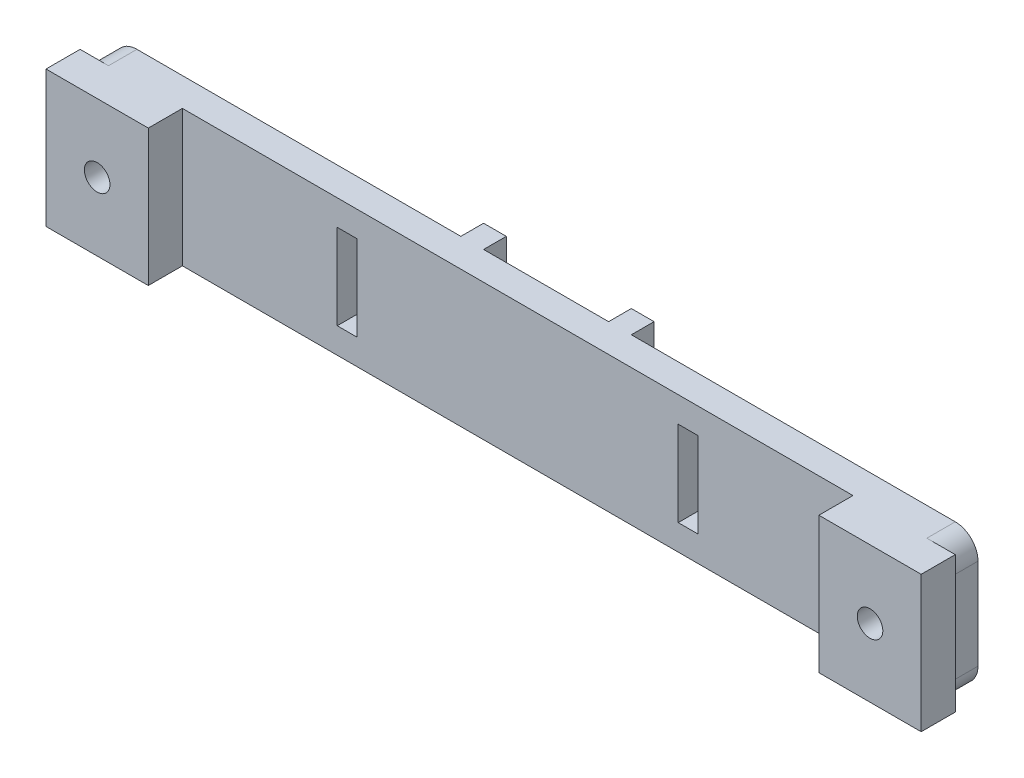
ISO-10303-21;
HEADER;
FILE_DESCRIPTION(('STEP AP214'),'2;1');
FILE_NAME('part.step','',(''),(''),'','','');
FILE_SCHEMA(('AUTOMOTIVE_DESIGN { 1 0 10303 214 1 1 1 1 }'));
ENDSEC;
DATA;
#1=APPLICATION_CONTEXT('core data for automotive mechanical design processes');
#2=APPLICATION_PROTOCOL_DEFINITION('international standard','automotive_design',2000,#1);
#3=PRODUCT_CONTEXT('',#1,'mechanical');
#4=PRODUCT('Part','Part','',(#3));
#5=PRODUCT_RELATED_PRODUCT_CATEGORY('part','',(#4));
#6=PRODUCT_DEFINITION_FORMATION('','',#4);
#7=PRODUCT_DEFINITION_CONTEXT('part definition',#1,'design');
#8=PRODUCT_DEFINITION('design','',#6,#7);
#9=PRODUCT_DEFINITION_SHAPE('','',#8);
#10=(LENGTH_UNIT() NAMED_UNIT(*) SI_UNIT(.MILLI.,.METRE.));
#11=(NAMED_UNIT(*) PLANE_ANGLE_UNIT() SI_UNIT($,.RADIAN.));
#12=(NAMED_UNIT(*) SI_UNIT($,.STERADIAN.) SOLID_ANGLE_UNIT());
#13=UNCERTAINTY_MEASURE_WITH_UNIT(LENGTH_MEASURE(1.E-05),#10,'distance_accuracy_value','');
#14=(GEOMETRIC_REPRESENTATION_CONTEXT(3) GLOBAL_UNCERTAINTY_ASSIGNED_CONTEXT((#13)) GLOBAL_UNIT_ASSIGNED_CONTEXT((#10,
#11,#12)) REPRESENTATION_CONTEXT('',''));
#15=CARTESIAN_POINT('',(0.,0.,0.));
#16=DIRECTION('',(0.,0.,1.));
#17=DIRECTION('',(1.,0.,0.));
#18=AXIS2_PLACEMENT_3D('',#15,#16,#17);
#19=CARTESIAN_POINT('',(-72.,-8.,0.));
#20=DIRECTION('',(0.,0.,1.));
#21=DIRECTION('',(1.,0.,0.));
#22=AXIS2_PLACEMENT_3D('',#19,#20,#21);
#23=PLANE('',#22);
#24=DIRECTION('',(1.,0.,0.));
#25=VECTOR('',#24,1.);
#26=CARTESIAN_POINT('',(28.25,-7.5,0.));
#27=LINE('',#26,#25);
#28=CARTESIAN_POINT('',(28.25,-7.5,0.));
#29=VERTEX_POINT('',#28);
#30=CARTESIAN_POINT('',(31.75,-7.5,0.));
#31=VERTEX_POINT('',#30);
#32=EDGE_CURVE('E478',#29,#31,#27,.T.);
#33=ORIENTED_EDGE('',*,*,#32,.T.);
#34=DIRECTION('',(0.,1.,0.));
#35=VECTOR('',#34,1.);
#36=CARTESIAN_POINT('',(31.75,-7.5,0.));
#37=LINE('',#36,#35);
#38=CARTESIAN_POINT('',(31.75,7.5,0.));
#39=VERTEX_POINT('',#38);
#40=EDGE_CURVE('E488',#31,#39,#37,.T.);
#41=ORIENTED_EDGE('',*,*,#40,.T.);
#42=DIRECTION('',(-1.,0.,0.));
#43=VECTOR('',#42,1.);
#44=CARTESIAN_POINT('',(28.25,7.5,0.));
#45=LINE('',#44,#43);
#46=CARTESIAN_POINT('',(28.25,7.5,0.));
#47=VERTEX_POINT('',#46);
#48=EDGE_CURVE('E500',#39,#47,#45,.T.);
#49=ORIENTED_EDGE('',*,*,#48,.T.);
#50=DIRECTION('',(0.,-1.,0.));
#51=VECTOR('',#50,1.);
#52=CARTESIAN_POINT('',(28.25,-7.5,0.));
#53=LINE('',#52,#51);
#54=EDGE_CURVE('E497',#47,#29,#53,.T.);
#55=ORIENTED_EDGE('',*,*,#54,.T.);
#56=EDGE_LOOP('',(#33,#41,#49,#55));
#57=FACE_BOUND('',#56,.T.);
#58=CARTESIAN_POINT('',(68.,0.,0.));
#59=DIRECTION('',(0.,0.,1.));
#60=DIRECTION('',(1.,0.,0.));
#61=AXIS2_PLACEMENT_3D('',#58,#59,#60);
#62=CIRCLE('',#61,2.25);
#63=CARTESIAN_POINT('',(70.25,0.,0.));
#64=VERTEX_POINT('',#63);
#65=EDGE_CURVE('E468',#64,#64,#62,.T.);
#66=ORIENTED_EDGE('',*,*,#65,.T.);
#67=EDGE_LOOP('',(#66));
#68=FACE_BOUND('',#67,.T.);
#69=DIRECTION('',(1.,0.,0.));
#70=VECTOR('',#69,1.);
#71=CARTESIAN_POINT('',(-72.,-12.,0.));
#72=LINE('',#71,#70);
#73=CARTESIAN_POINT('',(15.,-12.,0.));
#74=VERTEX_POINT('',#73);
#75=CARTESIAN_POINT('',(72.,-12.,0.));
#76=VERTEX_POINT('',#75);
#77=EDGE_CURVE('E251',#74,#76,#72,.T.);
#78=ORIENTED_EDGE('',*,*,#77,.F.);
#79=DIRECTION('',(0.,1.,0.));
#80=VECTOR('',#79,1.);
#81=CARTESIAN_POINT('',(15.,-12.,0.));
#82=LINE('',#81,#80);
#83=CARTESIAN_POINT('',(15.,12.,0.));
#84=VERTEX_POINT('',#83);
#85=EDGE_CURVE('E261',#74,#84,#82,.T.);
#86=ORIENTED_EDGE('',*,*,#85,.T.);
#87=DIRECTION('',(-1.,0.,0.));
#88=VECTOR('',#87,1.);
#89=CARTESIAN_POINT('',(72.,12.,0.));
#90=LINE('',#89,#88);
#91=CARTESIAN_POINT('',(72.,12.,0.));
#92=VERTEX_POINT('',#91);
#93=EDGE_CURVE('E289',#92,#84,#90,.T.);
#94=ORIENTED_EDGE('',*,*,#93,.F.);
#95=CARTESIAN_POINT('',(72.,8.,0.));
#96=DIRECTION('',(0.,0.,1.));
#97=DIRECTION('',(1.,0.,0.));
#98=AXIS2_PLACEMENT_3D('',#95,#96,#97);
#99=CIRCLE('',#98,3.99999999999999);
#100=CARTESIAN_POINT('',(76.,8.,0.));
#101=VERTEX_POINT('',#100);
#102=EDGE_CURVE('E284',#101,#92,#99,.T.);
#103=ORIENTED_EDGE('',*,*,#102,.F.);
#104=DIRECTION('',(0.,1.,0.));
#105=VECTOR('',#104,1.);
#106=CARTESIAN_POINT('',(76.,-8.,0.));
#107=LINE('',#106,#105);
#108=CARTESIAN_POINT('',(76.,-8.,0.));
#109=VERTEX_POINT('',#108);
#110=EDGE_CURVE('E281',#109,#101,#107,.T.);
#111=ORIENTED_EDGE('',*,*,#110,.F.);
#112=CARTESIAN_POINT('',(72.,-8.,0.));
#113=DIRECTION('',(0.,0.,1.));
#114=DIRECTION('',(1.,0.,0.));
#115=AXIS2_PLACEMENT_3D('',#112,#113,#114);
#116=CIRCLE('',#115,3.99999999999999);
#117=EDGE_CURVE('E271',#76,#109,#116,.T.);
#118=ORIENTED_EDGE('',*,*,#117,.F.);
#119=EDGE_LOOP('',(#78,#86,#94,#103,#111,#118));
#120=FACE_BOUND('',#119,.T.);
#121=ADVANCED_FACE('F36',(#57,#68,#120),#23,.F.);
#122=CARTESIAN_POINT('',(11.,12.,0.));
#123=VERTEX_POINT('',#122);
#124=CARTESIAN_POINT('',(-11.,12.,0.));
#125=VERTEX_POINT('',#124);
#126=EDGE_CURVE('E292',#123,#125,#90,.T.);
#127=ORIENTED_EDGE('',*,*,#126,.F.);
#128=DIRECTION('',(0.,-1.,0.));
#129=VECTOR('',#128,1.);
#130=CARTESIAN_POINT('',(11.,-12.,0.));
#131=LINE('',#130,#129);
#132=CARTESIAN_POINT('',(11.,-12.,0.));
#133=VERTEX_POINT('',#132);
#134=EDGE_CURVE('E51',#123,#133,#131,.T.);
#135=ORIENTED_EDGE('',*,*,#134,.T.);
#136=CARTESIAN_POINT('',(-11.,-12.,0.));
#137=VERTEX_POINT('',#136);
#138=EDGE_CURVE('E272',#137,#133,#72,.T.);
#139=ORIENTED_EDGE('',*,*,#138,.F.);
#140=DIRECTION('',(0.,1.,0.));
#141=VECTOR('',#140,1.);
#142=CARTESIAN_POINT('',(-11.,-12.,0.));
#143=LINE('',#142,#141);
#144=EDGE_CURVE('E267',#137,#125,#143,.T.);
#145=ORIENTED_EDGE('',*,*,#144,.T.);
#146=EDGE_LOOP('',(#127,#135,#139,#145));
#147=FACE_BOUND('',#146,.T.);
#148=ADVANCED_FACE('F558',(#147),#23,.F.);
#149=CARTESIAN_POINT('',(-72.,-8.,5.));
#150=DIRECTION('',(0.,0.,1.));
#151=DIRECTION('',(1.,0.,0.));
#152=AXIS2_PLACEMENT_3D('',#149,#150,#151);
#153=PLANE('',#152);
#154=DIRECTION('',(0.,1.,0.));
#155=VECTOR('',#154,1.);
#156=CARTESIAN_POINT('',(-28.25,-7.5,5.));
#157=LINE('',#156,#155);
#158=CARTESIAN_POINT('',(-28.25,-7.5,5.));
#159=VERTEX_POINT('',#158);
#160=CARTESIAN_POINT('',(-28.25,7.5,5.));
#161=VERTEX_POINT('',#160);
#162=EDGE_CURVE('E455',#159,#161,#157,.T.);
#163=ORIENTED_EDGE('',*,*,#162,.F.);
#164=DIRECTION('',(1.,0.,0.));
#165=VECTOR('',#164,1.);
#166=CARTESIAN_POINT('',(-31.75,-7.5,5.));
#167=LINE('',#166,#165);
#168=CARTESIAN_POINT('',(-31.75,-7.5,5.));
#169=VERTEX_POINT('',#168);
#170=EDGE_CURVE('E445',#169,#159,#167,.T.);
#171=ORIENTED_EDGE('',*,*,#170,.F.);
#172=DIRECTION('',(0.,-1.,0.));
#173=VECTOR('',#172,1.);
#174=CARTESIAN_POINT('',(-31.75,-7.5,5.));
#175=LINE('',#174,#173);
#176=CARTESIAN_POINT('',(-31.75,7.5,5.));
#177=VERTEX_POINT('',#176);
#178=EDGE_CURVE('E461',#177,#169,#175,.T.);
#179=ORIENTED_EDGE('',*,*,#178,.F.);
#180=DIRECTION('',(-1.,0.,0.));
#181=VECTOR('',#180,1.);
#182=CARTESIAN_POINT('',(-31.75,7.5,5.));
#183=LINE('',#182,#181);
#184=EDGE_CURVE('E457',#161,#177,#183,.T.);
#185=ORIENTED_EDGE('',*,*,#184,.F.);
#186=EDGE_LOOP('',(#163,#171,#179,#185));
#187=FACE_BOUND('',#186,.T.);
#188=DIRECTION('',(0.,1.,0.));
#189=VECTOR('',#188,1.);
#190=CARTESIAN_POINT('',(31.75,-7.5,5.));
#191=LINE('',#190,#189);
#192=CARTESIAN_POINT('',(31.75,-7.5,5.));
#193=VERTEX_POINT('',#192);
#194=CARTESIAN_POINT('',(31.75,7.5,5.));
#195=VERTEX_POINT('',#194);
#196=EDGE_CURVE('E458',#193,#195,#191,.T.);
#197=ORIENTED_EDGE('',*,*,#196,.F.);
#198=DIRECTION('',(1.,0.,0.));
#199=VECTOR('',#198,1.);
#200=CARTESIAN_POINT('',(28.25,-7.5,5.));
#201=LINE('',#200,#199);
#202=CARTESIAN_POINT('',(28.25,-7.5,5.));
#203=VERTEX_POINT('',#202);
#204=EDGE_CURVE('E484',#203,#193,#201,.T.);
#205=ORIENTED_EDGE('',*,*,#204,.F.);
#206=DIRECTION('',(0.,-1.,0.));
#207=VECTOR('',#206,1.);
#208=CARTESIAN_POINT('',(28.25,-7.5,5.));
#209=LINE('',#208,#207);
#210=CARTESIAN_POINT('',(28.25,7.5,5.));
#211=VERTEX_POINT('',#210);
#212=EDGE_CURVE('E487',#211,#203,#209,.T.);
#213=ORIENTED_EDGE('',*,*,#212,.F.);
#214=DIRECTION('',(-1.,0.,0.));
#215=VECTOR('',#214,1.);
#216=CARTESIAN_POINT('',(28.25,7.5,5.));
#217=LINE('',#216,#215);
#218=EDGE_CURVE('E491',#195,#211,#217,.T.);
#219=ORIENTED_EDGE('',*,*,#218,.F.);
#220=EDGE_LOOP('',(#197,#205,#213,#219));
#221=FACE_BOUND('',#220,.T.);
#222=DIRECTION('',(1.,0.,0.));
#223=VECTOR('',#222,1.);
#224=CARTESIAN_POINT('',(-72.,-12.,5.));
#225=LINE('',#224,#223);
#226=CARTESIAN_POINT('',(-59.,-12.,5.));
#227=VERTEX_POINT('',#226);
#228=CARTESIAN_POINT('',(59.,-12.,5.));
#229=VERTEX_POINT('',#228);
#230=EDGE_CURVE('E380',#227,#229,#225,.T.);
#231=ORIENTED_EDGE('',*,*,#230,.T.);
#232=DIRECTION('',(0.,-1.,0.));
#233=VECTOR('',#232,1.);
#234=CARTESIAN_POINT('',(59.,-12.,5.));
#235=LINE('',#234,#233);
#236=CARTESIAN_POINT('',(59.,12.,5.));
#237=VERTEX_POINT('',#236);
#238=EDGE_CURVE('E327',#237,#229,#235,.T.);
#239=ORIENTED_EDGE('',*,*,#238,.F.);
#240=DIRECTION('',(-1.,0.,0.));
#241=VECTOR('',#240,1.);
#242=CARTESIAN_POINT('',(72.,12.,5.));
#243=LINE('',#242,#241);
#244=CARTESIAN_POINT('',(-59.,12.,5.));
#245=VERTEX_POINT('',#244);
#246=EDGE_CURVE('E388',#237,#245,#243,.T.);
#247=ORIENTED_EDGE('',*,*,#246,.T.);
#248=DIRECTION('',(0.,1.,0.));
#249=VECTOR('',#248,1.);
#250=CARTESIAN_POINT('',(-59.,-12.,5.));
#251=LINE('',#250,#249);
#252=EDGE_CURVE('E343',#227,#245,#251,.T.);
#253=ORIENTED_EDGE('',*,*,#252,.F.);
#254=EDGE_LOOP('',(#231,#239,#247,#253));
#255=FACE_BOUND('',#254,.T.);
#256=ADVANCED_FACE('F538',(#187,#221,#255),#153,.T.);
#257=CARTESIAN_POINT('',(-72.,-8.,5.));
#258=DIRECTION('',(0.,0.,-1.));
#259=DIRECTION('',(-1.,0.,0.));
#260=AXIS2_PLACEMENT_3D('',#257,#258,#259);
#261=CYLINDRICAL_SURFACE('',#260,3.99999999999999);
#262=CARTESIAN_POINT('',(-72.,-8.,0.));
#263=DIRECTION('',(0.,0.,1.));
#264=DIRECTION('',(1.,0.,0.));
#265=AXIS2_PLACEMENT_3D('',#262,#263,#264);
#266=CIRCLE('',#265,3.99999999999999);
#267=CARTESIAN_POINT('',(-76.,-8.,0.));
#268=VERTEX_POINT('',#267);
#269=CARTESIAN_POINT('',(-72.,-12.,0.));
#270=VERTEX_POINT('',#269);
#271=EDGE_CURVE('E273',#268,#270,#266,.T.);
#272=ORIENTED_EDGE('',*,*,#271,.T.);
#273=DIRECTION('',(0.,0.,-1.));
#274=VECTOR('',#273,1.);
#275=CARTESIAN_POINT('',(-72.,-12.,5.));
#276=LINE('',#275,#274);
#277=CARTESIAN_POINT('',(-72.,-12.,5.));
#278=VERTEX_POINT('',#277);
#279=EDGE_CURVE('E11',#278,#270,#276,.T.);
#280=ORIENTED_EDGE('',*,*,#279,.F.);
#281=CARTESIAN_POINT('',(-72.,-8.,5.));
#282=DIRECTION('',(0.,0.,1.));
#283=DIRECTION('',(1.,0.,0.));
#284=AXIS2_PLACEMENT_3D('',#281,#282,#283);
#285=CIRCLE('',#284,3.99999999999999);
#286=CARTESIAN_POINT('',(-76.,-8.,5.));
#287=VERTEX_POINT('',#286);
#288=EDGE_CURVE('E296',#287,#278,#285,.T.);
#289=ORIENTED_EDGE('',*,*,#288,.F.);
#290=DIRECTION('',(0.,0.,-1.));
#291=VECTOR('',#290,1.);
#292=CARTESIAN_POINT('',(-76.,-8.,5.));
#293=LINE('',#292,#291);
#294=EDGE_CURVE('E297',#287,#268,#293,.T.);
#295=ORIENTED_EDGE('',*,*,#294,.T.);
#296=EDGE_LOOP('',(#272,#280,#289,#295));
#297=FACE_BOUND('',#296,.T.);
#298=ADVANCED_FACE('F38',(#297),#261,.T.);
#299=CARTESIAN_POINT('',(-72.,-12.,5.));
#300=DIRECTION('',(0.,1.,0.));
#301=DIRECTION('',(0.,0.,1.));
#302=AXIS2_PLACEMENT_3D('',#299,#300,#301);
#303=PLANE('',#302);
#304=CARTESIAN_POINT('',(-15.,-12.,0.));
#305=VERTEX_POINT('',#304);
#306=EDGE_CURVE('E275',#270,#305,#72,.T.);
#307=ORIENTED_EDGE('',*,*,#306,.T.);
#308=DIRECTION('',(0.,0.,1.));
#309=VECTOR('',#308,1.);
#310=CARTESIAN_POINT('',(-15.,-12.,-4.));
#311=LINE('',#310,#309);
#312=CARTESIAN_POINT('',(-15.,-12.,-4.));
#313=VERTEX_POINT('',#312);
#314=EDGE_CURVE('E59',#313,#305,#311,.T.);
#315=ORIENTED_EDGE('',*,*,#314,.F.);
#316=DIRECTION('',(1.,0.,0.));
#317=VECTOR('',#316,1.);
#318=CARTESIAN_POINT('',(-15.,-12.,-4.));
#319=LINE('',#318,#317);
#320=CARTESIAN_POINT('',(-11.,-12.,-4.));
#321=VERTEX_POINT('',#320);
#322=EDGE_CURVE('E440',#313,#321,#319,.T.);
#323=ORIENTED_EDGE('',*,*,#322,.T.);
#324=DIRECTION('',(0.,0.,1.));
#325=VECTOR('',#324,1.);
#326=CARTESIAN_POINT('',(-11.,-12.,-4.));
#327=LINE('',#326,#325);
#328=EDGE_CURVE('E431',#321,#137,#327,.T.);
#329=ORIENTED_EDGE('',*,*,#328,.T.);
#330=ORIENTED_EDGE('',*,*,#138,.T.);
#331=DIRECTION('',(0.,0.,1.));
#332=VECTOR('',#331,1.);
#333=CARTESIAN_POINT('',(11.,-12.,-4.));
#334=LINE('',#333,#332);
#335=CARTESIAN_POINT('',(11.,-12.,-4.));
#336=VERTEX_POINT('',#335);
#337=EDGE_CURVE('E258',#336,#133,#334,.T.);
#338=ORIENTED_EDGE('',*,*,#337,.F.);
#339=DIRECTION('',(1.,0.,0.));
#340=VECTOR('',#339,1.);
#341=CARTESIAN_POINT('',(11.,-12.,-4.));
#342=LINE('',#341,#340);
#343=CARTESIAN_POINT('',(15.,-12.,-4.));
#344=VERTEX_POINT('',#343);
#345=EDGE_CURVE('E254',#336,#344,#342,.T.);
#346=ORIENTED_EDGE('',*,*,#345,.T.);
#347=DIRECTION('',(0.,0.,1.));
#348=VECTOR('',#347,1.);
#349=CARTESIAN_POINT('',(15.,-12.,-4.));
#350=LINE('',#349,#348);
#351=EDGE_CURVE('E245',#344,#74,#350,.T.);
#352=ORIENTED_EDGE('',*,*,#351,.T.);
#353=ORIENTED_EDGE('',*,*,#77,.T.);
#354=DIRECTION('',(0.,0.,-1.));
#355=VECTOR('',#354,1.);
#356=CARTESIAN_POINT('',(72.,-12.,5.));
#357=LINE('',#356,#355);
#358=CARTESIAN_POINT('',(72.,-12.,5.));
#359=VERTEX_POINT('',#358);
#360=EDGE_CURVE('E44',#359,#76,#357,.T.);
#361=ORIENTED_EDGE('',*,*,#360,.F.);
#362=DIRECTION('',(1.,0.,0.));
#363=VECTOR('',#362,1.);
#364=CARTESIAN_POINT('',(59.,-12.,5.));
#365=LINE('',#364,#363);
#366=CARTESIAN_POINT('',(77.,-12.,5.));
#367=VERTEX_POINT('',#366);
#368=EDGE_CURVE('E319',#359,#367,#365,.T.);
#369=ORIENTED_EDGE('',*,*,#368,.T.);
#370=DIRECTION('',(0.,0.,-1.));
#371=VECTOR('',#370,1.);
#372=CARTESIAN_POINT('',(77.,-12.,11.));
#373=LINE('',#372,#371);
#374=CARTESIAN_POINT('',(77.,-12.,11.));
#375=VERTEX_POINT('',#374);
#376=EDGE_CURVE('E337',#375,#367,#373,.T.);
#377=ORIENTED_EDGE('',*,*,#376,.F.);
#378=DIRECTION('',(1.,0.,0.));
#379=VECTOR('',#378,1.);
#380=CARTESIAN_POINT('',(59.,-12.,11.));
#381=LINE('',#380,#379);
#382=CARTESIAN_POINT('',(59.,-12.,11.));
#383=VERTEX_POINT('',#382);
#384=EDGE_CURVE('E344',#383,#375,#381,.T.);
#385=ORIENTED_EDGE('',*,*,#384,.F.);
#386=DIRECTION('',(0.,0.,-1.));
#387=VECTOR('',#386,1.);
#388=CARTESIAN_POINT('',(59.,-12.,11.));
#389=LINE('',#388,#387);
#390=EDGE_CURVE('E521',#383,#229,#389,.T.);
#391=ORIENTED_EDGE('',*,*,#390,.T.);
#392=ORIENTED_EDGE('',*,*,#230,.F.);
#393=DIRECTION('',(0.,0.,-1.));
#394=VECTOR('',#393,1.);
#395=CARTESIAN_POINT('',(-59.,-12.,11.));
#396=LINE('',#395,#394);
#397=CARTESIAN_POINT('',(-59.,-12.,11.));
#398=VERTEX_POINT('',#397);
#399=EDGE_CURVE('E359',#398,#227,#396,.T.);
#400=ORIENTED_EDGE('',*,*,#399,.F.);
#401=DIRECTION('',(1.,0.,0.));
#402=VECTOR('',#401,1.);
#403=CARTESIAN_POINT('',(-77.,-12.,11.));
#404=LINE('',#403,#402);
#405=CARTESIAN_POINT('',(-77.,-12.,11.));
#406=VERTEX_POINT('',#405);
#407=EDGE_CURVE('E357',#406,#398,#404,.T.);
#408=ORIENTED_EDGE('',*,*,#407,.F.);
#409=DIRECTION('',(0.,0.,-1.));
#410=VECTOR('',#409,1.);
#411=CARTESIAN_POINT('',(-77.,-12.,11.));
#412=LINE('',#411,#410);
#413=CARTESIAN_POINT('',(-77.,-12.,5.));
#414=VERTEX_POINT('',#413);
#415=EDGE_CURVE('E370',#406,#414,#412,.T.);
#416=ORIENTED_EDGE('',*,*,#415,.T.);
#417=DIRECTION('',(1.,0.,0.));
#418=VECTOR('',#417,1.);
#419=CARTESIAN_POINT('',(-77.,-12.,5.));
#420=LINE('',#419,#418);
#421=EDGE_CURVE('E353',#414,#278,#420,.T.);
#422=ORIENTED_EDGE('',*,*,#421,.T.);
#423=ORIENTED_EDGE('',*,*,#279,.T.);
#424=EDGE_LOOP('',(#307,#315,#323,#329,#330,#338,#346,#352,#353,#361,#369,#377,#385,#391,#392,
#400,#408,#416,#422,#423));
#425=FACE_BOUND('',#424,.T.);
#426=ADVANCED_FACE('F248',(#425),#303,.F.);
#427=CARTESIAN_POINT('',(72.,-8.,5.));
#428=DIRECTION('',(0.,0.,-1.));
#429=DIRECTION('',(-1.,0.,0.));
#430=AXIS2_PLACEMENT_3D('',#427,#428,#429);
#431=CYLINDRICAL_SURFACE('',#430,3.99999999999999);
#432=ORIENTED_EDGE('',*,*,#117,.T.);
#433=DIRECTION('',(0.,0.,-1.));
#434=VECTOR('',#433,1.);
#435=CARTESIAN_POINT('',(76.,-8.,5.));
#436=LINE('',#435,#434);
#437=CARTESIAN_POINT('',(76.,-8.,5.));
#438=VERTEX_POINT('',#437);
#439=EDGE_CURVE('E313',#438,#109,#436,.T.);
#440=ORIENTED_EDGE('',*,*,#439,.F.);
#441=CARTESIAN_POINT('',(72.,-8.,5.));
#442=DIRECTION('',(0.,0.,1.));
#443=DIRECTION('',(1.,0.,0.));
#444=AXIS2_PLACEMENT_3D('',#441,#442,#443);
#445=CIRCLE('',#444,3.99999999999999);
#446=EDGE_CURVE('E316',#359,#438,#445,.T.);
#447=ORIENTED_EDGE('',*,*,#446,.F.);
#448=ORIENTED_EDGE('',*,*,#360,.T.);
#449=EDGE_LOOP('',(#432,#440,#447,#448));
#450=FACE_BOUND('',#449,.T.);
#451=ADVANCED_FACE('F314',(#450),#431,.T.);
#452=CARTESIAN_POINT('',(76.,-8.,5.));
#453=DIRECTION('',(-1.,0.,0.));
#454=DIRECTION('',(0.,0.,1.));
#455=AXIS2_PLACEMENT_3D('',#452,#453,#454);
#456=PLANE('',#455);
#457=ORIENTED_EDGE('',*,*,#110,.T.);
#458=DIRECTION('',(0.,0.,-1.));
#459=VECTOR('',#458,1.);
#460=CARTESIAN_POINT('',(76.,8.,5.));
#461=LINE('',#460,#459);
#462=CARTESIAN_POINT('',(76.,8.,5.));
#463=VERTEX_POINT('',#462);
#464=EDGE_CURVE('E310',#463,#101,#461,.T.);
#465=ORIENTED_EDGE('',*,*,#464,.F.);
#466=DIRECTION('',(0.,1.,0.));
#467=VECTOR('',#466,1.);
#468=CARTESIAN_POINT('',(76.,-8.,5.));
#469=LINE('',#468,#467);
#470=EDGE_CURVE('E383',#438,#463,#469,.T.);
#471=ORIENTED_EDGE('',*,*,#470,.F.);
#472=ORIENTED_EDGE('',*,*,#439,.T.);
#473=EDGE_LOOP('',(#457,#465,#471,#472));
#474=FACE_BOUND('',#473,.T.);
#475=ADVANCED_FACE('F855',(#474),#456,.F.);
#476=CARTESIAN_POINT('',(72.,8.,5.));
#477=DIRECTION('',(0.,0.,-1.));
#478=DIRECTION('',(-1.,0.,0.));
#479=AXIS2_PLACEMENT_3D('',#476,#477,#478);
#480=CYLINDRICAL_SURFACE('',#479,3.99999999999999);
#481=ORIENTED_EDGE('',*,*,#102,.T.);
#482=DIRECTION('',(0.,0.,-1.));
#483=VECTOR('',#482,1.);
#484=CARTESIAN_POINT('',(72.,12.,5.));
#485=LINE('',#484,#483);
#486=CARTESIAN_POINT('',(72.,12.,5.));
#487=VERTEX_POINT('',#486);
#488=EDGE_CURVE('E307',#487,#92,#485,.T.);
#489=ORIENTED_EDGE('',*,*,#488,.F.);
#490=CARTESIAN_POINT('',(72.,8.,5.));
#491=DIRECTION('',(0.,0.,1.));
#492=DIRECTION('',(1.,0.,0.));
#493=AXIS2_PLACEMENT_3D('',#490,#491,#492);
#494=CIRCLE('',#493,3.99999999999999);
#495=EDGE_CURVE('E385',#463,#487,#494,.T.);
#496=ORIENTED_EDGE('',*,*,#495,.F.);
#497=ORIENTED_EDGE('',*,*,#464,.T.);
#498=EDGE_LOOP('',(#481,#489,#496,#497));
#499=FACE_BOUND('',#498,.T.);
#500=ADVANCED_FACE('F743',(#499),#480,.T.);
#501=CARTESIAN_POINT('',(72.,12.,5.));
#502=DIRECTION('',(0.,-1.,0.));
#503=DIRECTION('',(0.,0.,-1.));
#504=AXIS2_PLACEMENT_3D('',#501,#502,#503);
#505=PLANE('',#504);
#506=ORIENTED_EDGE('',*,*,#93,.T.);
#507=DIRECTION('',(0.,0.,1.));
#508=VECTOR('',#507,1.);
#509=CARTESIAN_POINT('',(15.,12.,-4.));
#510=LINE('',#509,#508);
#511=CARTESIAN_POINT('',(15.,12.,-4.));
#512=VERTEX_POINT('',#511);
#513=EDGE_CURVE('E263',#512,#84,#510,.T.);
#514=ORIENTED_EDGE('',*,*,#513,.F.);
#515=DIRECTION('',(-1.,0.,0.));
#516=VECTOR('',#515,1.);
#517=CARTESIAN_POINT('',(11.,12.,-4.));
#518=LINE('',#517,#516);
#519=CARTESIAN_POINT('',(11.,12.,-4.));
#520=VERTEX_POINT('',#519);
#521=EDGE_CURVE('E826',#512,#520,#518,.T.);
#522=ORIENTED_EDGE('',*,*,#521,.T.);
#523=DIRECTION('',(0.,0.,1.));
#524=VECTOR('',#523,1.);
#525=CARTESIAN_POINT('',(11.,12.,-4.));
#526=LINE('',#525,#524);
#527=EDGE_CURVE('E845',#520,#123,#526,.T.);
#528=ORIENTED_EDGE('',*,*,#527,.T.);
#529=ORIENTED_EDGE('',*,*,#126,.T.);
#530=DIRECTION('',(0.,0.,1.));
#531=VECTOR('',#530,1.);
#532=CARTESIAN_POINT('',(-11.,12.,-4.));
#533=LINE('',#532,#531);
#534=CARTESIAN_POINT('',(-11.,12.,-4.));
#535=VERTEX_POINT('',#534);
#536=EDGE_CURVE('E437',#535,#125,#533,.T.);
#537=ORIENTED_EDGE('',*,*,#536,.F.);
#538=DIRECTION('',(-1.,0.,0.));
#539=VECTOR('',#538,1.);
#540=CARTESIAN_POINT('',(-15.,12.,-4.));
#541=LINE('',#540,#539);
#542=CARTESIAN_POINT('',(-15.,12.,-4.));
#543=VERTEX_POINT('',#542);
#544=EDGE_CURVE('E425',#535,#543,#541,.T.);
#545=ORIENTED_EDGE('',*,*,#544,.T.);
#546=DIRECTION('',(0.,0.,1.));
#547=VECTOR('',#546,1.);
#548=CARTESIAN_POINT('',(-15.,12.,-4.));
#549=LINE('',#548,#547);
#550=CARTESIAN_POINT('',(-15.,12.,0.));
#551=VERTEX_POINT('',#550);
#552=EDGE_CURVE('E435',#543,#551,#549,.T.);
#553=ORIENTED_EDGE('',*,*,#552,.T.);
#554=CARTESIAN_POINT('',(-72.,12.,0.));
#555=VERTEX_POINT('',#554);
#556=EDGE_CURVE('E288',#551,#555,#90,.T.);
#557=ORIENTED_EDGE('',*,*,#556,.T.);
#558=DIRECTION('',(0.,0.,-1.));
#559=VECTOR('',#558,1.);
#560=CARTESIAN_POINT('',(-72.,12.,5.));
#561=LINE('',#560,#559);
#562=CARTESIAN_POINT('',(-72.,12.,5.));
#563=VERTEX_POINT('',#562);
#564=EDGE_CURVE('E304',#563,#555,#561,.T.);
#565=ORIENTED_EDGE('',*,*,#564,.F.);
#566=DIRECTION('',(-1.,0.,0.));
#567=VECTOR('',#566,1.);
#568=CARTESIAN_POINT('',(-77.,12.,5.));
#569=LINE('',#568,#567);
#570=CARTESIAN_POINT('',(-77.,12.,5.));
#571=VERTEX_POINT('',#570);
#572=EDGE_CURVE('E362',#563,#571,#569,.T.);
#573=ORIENTED_EDGE('',*,*,#572,.T.);
#574=DIRECTION('',(0.,0.,-1.));
#575=VECTOR('',#574,1.);
#576=CARTESIAN_POINT('',(-77.,12.,11.));
#577=LINE('',#576,#575);
#578=CARTESIAN_POINT('',(-77.,12.,11.));
#579=VERTEX_POINT('',#578);
#580=EDGE_CURVE('E373',#579,#571,#577,.T.);
#581=ORIENTED_EDGE('',*,*,#580,.F.);
#582=DIRECTION('',(-1.,0.,0.));
#583=VECTOR('',#582,1.);
#584=CARTESIAN_POINT('',(-77.,12.,11.));
#585=LINE('',#584,#583);
#586=CARTESIAN_POINT('',(-59.,12.,11.));
#587=VERTEX_POINT('',#586);
#588=EDGE_CURVE('E352',#587,#579,#585,.T.);
#589=ORIENTED_EDGE('',*,*,#588,.F.);
#590=DIRECTION('',(0.,0.,-1.));
#591=VECTOR('',#590,1.);
#592=CARTESIAN_POINT('',(-59.,12.,11.));
#593=LINE('',#592,#591);
#594=EDGE_CURVE('E278',#587,#245,#593,.T.);
#595=ORIENTED_EDGE('',*,*,#594,.T.);
#596=ORIENTED_EDGE('',*,*,#246,.F.);
#597=DIRECTION('',(0.,0.,-1.));
#598=VECTOR('',#597,1.);
#599=CARTESIAN_POINT('',(59.,12.,11.));
#600=LINE('',#599,#598);
#601=CARTESIAN_POINT('',(59.,12.,11.));
#602=VERTEX_POINT('',#601);
#603=EDGE_CURVE('E519',#602,#237,#600,.T.);
#604=ORIENTED_EDGE('',*,*,#603,.F.);
#605=DIRECTION('',(-1.,0.,0.));
#606=VECTOR('',#605,1.);
#607=CARTESIAN_POINT('',(59.,12.,11.));
#608=LINE('',#607,#606);
#609=CARTESIAN_POINT('',(77.,12.,11.));
#610=VERTEX_POINT('',#609);
#611=EDGE_CURVE('E334',#610,#602,#608,.T.);
#612=ORIENTED_EDGE('',*,*,#611,.F.);
#613=DIRECTION('',(0.,0.,-1.));
#614=VECTOR('',#613,1.);
#615=CARTESIAN_POINT('',(77.,12.,11.));
#616=LINE('',#615,#614);
#617=CARTESIAN_POINT('',(77.,12.,5.));
#618=VERTEX_POINT('',#617);
#619=EDGE_CURVE('E508',#610,#618,#616,.T.);
#620=ORIENTED_EDGE('',*,*,#619,.T.);
#621=DIRECTION('',(-1.,0.,0.));
#622=VECTOR('',#621,1.);
#623=CARTESIAN_POINT('',(59.,12.,5.));
#624=LINE('',#623,#622);
#625=EDGE_CURVE('E331',#618,#487,#624,.T.);
#626=ORIENTED_EDGE('',*,*,#625,.T.);
#627=ORIENTED_EDGE('',*,*,#488,.T.);
#628=EDGE_LOOP('',(#506,#514,#522,#528,#529,#537,#545,#553,#557,#565,#573,#581,#589,#595,#596,
#604,#612,#620,#626,#627));
#629=FACE_BOUND('',#628,.T.);
#630=ADVANCED_FACE('F414',(#629),#505,.F.);
#631=CARTESIAN_POINT('',(-72.,8.,5.));
#632=DIRECTION('',(0.,0.,-1.));
#633=DIRECTION('',(-1.,0.,0.));
#634=AXIS2_PLACEMENT_3D('',#631,#632,#633);
#635=CYLINDRICAL_SURFACE('',#634,3.99999999999999);
#636=CARTESIAN_POINT('',(-72.,8.,0.));
#637=DIRECTION('',(0.,0.,1.));
#638=DIRECTION('',(1.,0.,0.));
#639=AXIS2_PLACEMENT_3D('',#636,#637,#638);
#640=CIRCLE('',#639,3.99999999999999);
#641=CARTESIAN_POINT('',(-76.,8.,0.));
#642=VERTEX_POINT('',#641);
#643=EDGE_CURVE('E291',#555,#642,#640,.T.);
#644=ORIENTED_EDGE('',*,*,#643,.T.);
#645=DIRECTION('',(0.,0.,-1.));
#646=VECTOR('',#645,1.);
#647=CARTESIAN_POINT('',(-76.,8.,5.));
#648=LINE('',#647,#646);
#649=CARTESIAN_POINT('',(-76.,8.,5.));
#650=VERTEX_POINT('',#649);
#651=EDGE_CURVE('E300',#650,#642,#648,.T.);
#652=ORIENTED_EDGE('',*,*,#651,.F.);
#653=CARTESIAN_POINT('',(-72.,8.,5.));
#654=DIRECTION('',(0.,0.,1.));
#655=DIRECTION('',(1.,0.,0.));
#656=AXIS2_PLACEMENT_3D('',#653,#654,#655);
#657=CIRCLE('',#656,3.99999999999999);
#658=EDGE_CURVE('E390',#563,#650,#657,.T.);
#659=ORIENTED_EDGE('',*,*,#658,.F.);
#660=ORIENTED_EDGE('',*,*,#564,.T.);
#661=EDGE_LOOP('',(#644,#652,#659,#660));
#662=FACE_BOUND('',#661,.T.);
#663=ADVANCED_FACE('F418',(#662),#635,.T.);
#664=CARTESIAN_POINT('',(-76.,8.,5.));
#665=DIRECTION('',(1.,0.,0.));
#666=DIRECTION('',(0.,0.,-1.));
#667=AXIS2_PLACEMENT_3D('',#664,#665,#666);
#668=PLANE('',#667);
#669=DIRECTION('',(0.,-1.,0.));
#670=VECTOR('',#669,1.);
#671=CARTESIAN_POINT('',(-76.,8.,0.));
#672=LINE('',#671,#670);
#673=EDGE_CURVE('E294',#642,#268,#672,.T.);
#674=ORIENTED_EDGE('',*,*,#673,.T.);
#675=ORIENTED_EDGE('',*,*,#294,.F.);
#676=DIRECTION('',(0.,-1.,0.));
#677=VECTOR('',#676,1.);
#678=CARTESIAN_POINT('',(-76.,8.,5.));
#679=LINE('',#678,#677);
#680=EDGE_CURVE('E301',#650,#287,#679,.T.);
#681=ORIENTED_EDGE('',*,*,#680,.F.);
#682=ORIENTED_EDGE('',*,*,#651,.T.);
#683=EDGE_LOOP('',(#674,#675,#681,#682));
#684=FACE_BOUND('',#683,.T.);
#685=ADVANCED_FACE('F402',(#684),#668,.F.);
#686=DIRECTION('',(1.,0.,0.));
#687=VECTOR('',#686,1.);
#688=CARTESIAN_POINT('',(-31.75,-7.5,0.));
#689=LINE('',#688,#687);
#690=CARTESIAN_POINT('',(-31.75,-7.5,0.));
#691=VERTEX_POINT('',#690);
#692=CARTESIAN_POINT('',(-28.25,-7.5,0.));
#693=VERTEX_POINT('',#692);
#694=EDGE_CURVE('E451',#691,#693,#689,.T.);
#695=ORIENTED_EDGE('',*,*,#694,.T.);
#696=DIRECTION('',(0.,1.,0.));
#697=VECTOR('',#696,1.);
#698=CARTESIAN_POINT('',(-28.25,-7.5,0.));
#699=LINE('',#698,#697);
#700=CARTESIAN_POINT('',(-28.25,7.5,0.));
#701=VERTEX_POINT('',#700);
#702=EDGE_CURVE('E441',#693,#701,#699,.T.);
#703=ORIENTED_EDGE('',*,*,#702,.T.);
#704=DIRECTION('',(-1.,0.,0.));
#705=VECTOR('',#704,1.);
#706=CARTESIAN_POINT('',(-31.75,7.5,0.));
#707=LINE('',#706,#705);
#708=CARTESIAN_POINT('',(-31.75,7.5,0.));
#709=VERTEX_POINT('',#708);
#710=EDGE_CURVE('E444',#701,#709,#707,.T.);
#711=ORIENTED_EDGE('',*,*,#710,.T.);
#712=DIRECTION('',(0.,-1.,0.));
#713=VECTOR('',#712,1.);
#714=CARTESIAN_POINT('',(-31.75,-7.5,0.));
#715=LINE('',#714,#713);
#716=EDGE_CURVE('E448',#709,#691,#715,.T.);
#717=ORIENTED_EDGE('',*,*,#716,.T.);
#718=EDGE_LOOP('',(#695,#703,#711,#717));
#719=FACE_BOUND('',#718,.T.);
#720=CARTESIAN_POINT('',(-68.,0.,0.));
#721=DIRECTION('',(0.,0.,1.));
#722=DIRECTION('',(1.,0.,0.));
#723=AXIS2_PLACEMENT_3D('',#720,#721,#722);
#724=CIRCLE('',#723,2.25);
#725=CARTESIAN_POINT('',(-65.75,0.,0.));
#726=VERTEX_POINT('',#725);
#727=EDGE_CURVE('E505',#726,#726,#724,.T.);
#728=ORIENTED_EDGE('',*,*,#727,.T.);
#729=EDGE_LOOP('',(#728));
#730=FACE_BOUND('',#729,.T.);
#731=ORIENTED_EDGE('',*,*,#556,.F.);
#732=DIRECTION('',(0.,-1.,0.));
#733=VECTOR('',#732,1.);
#734=CARTESIAN_POINT('',(-15.,-12.,0.));
#735=LINE('',#734,#733);
#736=EDGE_CURVE('E421',#551,#305,#735,.T.);
#737=ORIENTED_EDGE('',*,*,#736,.T.);
#738=ORIENTED_EDGE('',*,*,#306,.F.);
#739=ORIENTED_EDGE('',*,*,#271,.F.);
#740=ORIENTED_EDGE('',*,*,#673,.F.);
#741=ORIENTED_EDGE('',*,*,#643,.F.);
#742=EDGE_LOOP('',(#731,#737,#738,#739,#740,#741));
#743=FACE_BOUND('',#742,.T.);
#744=ADVANCED_FACE('F420',(#719,#730,#743),#23,.F.);
#745=CARTESIAN_POINT('',(-59.,-12.,11.));
#746=DIRECTION('',(-1.,0.,0.));
#747=DIRECTION('',(0.,0.,1.));
#748=AXIS2_PLACEMENT_3D('',#745,#746,#747);
#749=PLANE('',#748);
#750=ORIENTED_EDGE('',*,*,#252,.T.);
#751=ORIENTED_EDGE('',*,*,#594,.F.);
#752=DIRECTION('',(0.,1.,0.));
#753=VECTOR('',#752,1.);
#754=CARTESIAN_POINT('',(-59.,-12.,11.));
#755=LINE('',#754,#753);
#756=EDGE_CURVE('E349',#398,#587,#755,.T.);
#757=ORIENTED_EDGE('',*,*,#756,.F.);
#758=ORIENTED_EDGE('',*,*,#399,.T.);
#759=EDGE_LOOP('',(#750,#751,#757,#758));
#760=FACE_BOUND('',#759,.T.);
#761=ADVANCED_FACE('F542',(#760),#749,.F.);
#762=CARTESIAN_POINT('',(-77.,-12.,11.));
#763=DIRECTION('',(1.,0.,0.));
#764=DIRECTION('',(0.,0.,-1.));
#765=AXIS2_PLACEMENT_3D('',#762,#763,#764);
#766=PLANE('',#765);
#767=DIRECTION('',(0.,-1.,0.));
#768=VECTOR('',#767,1.);
#769=CARTESIAN_POINT('',(-77.,-12.,5.));
#770=LINE('',#769,#768);
#771=EDGE_CURVE('E364',#571,#414,#770,.T.);
#772=ORIENTED_EDGE('',*,*,#771,.T.);
#773=ORIENTED_EDGE('',*,*,#415,.F.);
#774=DIRECTION('',(0.,-1.,0.));
#775=VECTOR('',#774,1.);
#776=CARTESIAN_POINT('',(-77.,-12.,11.));
#777=LINE('',#776,#775);
#778=EDGE_CURVE('E355',#579,#406,#777,.T.);
#779=ORIENTED_EDGE('',*,*,#778,.F.);
#780=ORIENTED_EDGE('',*,*,#580,.T.);
#781=EDGE_LOOP('',(#772,#773,#779,#780));
#782=FACE_BOUND('',#781,.T.);
#783=ADVANCED_FACE('F410',(#782),#766,.F.);
#784=CARTESIAN_POINT('',(0.,0.,11.));
#785=DIRECTION('',(0.,0.,-1.));
#786=DIRECTION('',(-1.,0.,0.));
#787=AXIS2_PLACEMENT_3D('',#784,#785,#786);
#788=PLANE('',#787);
#789=CARTESIAN_POINT('',(-68.,0.,11.));
#790=DIRECTION('',(0.,0.,1.));
#791=DIRECTION('',(1.,0.,0.));
#792=AXIS2_PLACEMENT_3D('',#789,#790,#791);
#793=CIRCLE('',#792,2.25);
#794=CARTESIAN_POINT('',(-65.75,0.,11.));
#795=VERTEX_POINT('',#794);
#796=EDGE_CURVE('E509',#795,#795,#793,.T.);
#797=ORIENTED_EDGE('',*,*,#796,.F.);
#798=EDGE_LOOP('',(#797));
#799=FACE_BOUND('',#798,.T.);
#800=ORIENTED_EDGE('',*,*,#756,.T.);
#801=ORIENTED_EDGE('',*,*,#588,.T.);
#802=ORIENTED_EDGE('',*,*,#778,.T.);
#803=ORIENTED_EDGE('',*,*,#407,.T.);
#804=EDGE_LOOP('',(#800,#801,#802,#803));
#805=FACE_BOUND('',#804,.T.);
#806=ADVANCED_FACE('F545',(#799,#805),#788,.F.);
#807=CARTESIAN_POINT('',(0.,0.,5.));
#808=DIRECTION('',(0.,0.,-1.));
#809=DIRECTION('',(-1.,0.,0.));
#810=AXIS2_PLACEMENT_3D('',#807,#808,#809);
#811=PLANE('',#810);
#812=ORIENTED_EDGE('',*,*,#680,.T.);
#813=ORIENTED_EDGE('',*,*,#288,.T.);
#814=ORIENTED_EDGE('',*,*,#421,.F.);
#815=ORIENTED_EDGE('',*,*,#771,.F.);
#816=ORIENTED_EDGE('',*,*,#572,.F.);
#817=ORIENTED_EDGE('',*,*,#658,.T.);
#818=EDGE_LOOP('',(#812,#813,#814,#815,#816,#817));
#819=FACE_BOUND('',#818,.T.);
#820=ADVANCED_FACE('F396',(#819),#811,.T.);
#821=CARTESIAN_POINT('',(0.,0.,5.));
#822=DIRECTION('',(0.,0.,-1.));
#823=DIRECTION('',(-1.,0.,0.));
#824=AXIS2_PLACEMENT_3D('',#821,#822,#823);
#825=PLANE('',#824);
#826=ORIENTED_EDGE('',*,*,#446,.T.);
#827=ORIENTED_EDGE('',*,*,#470,.T.);
#828=ORIENTED_EDGE('',*,*,#495,.T.);
#829=ORIENTED_EDGE('',*,*,#625,.F.);
#830=DIRECTION('',(0.,1.,0.));
#831=VECTOR('',#830,1.);
#832=CARTESIAN_POINT('',(77.,-12.,5.));
#833=LINE('',#832,#831);
#834=EDGE_CURVE('E326',#367,#618,#833,.T.);
#835=ORIENTED_EDGE('',*,*,#834,.F.);
#836=ORIENTED_EDGE('',*,*,#368,.F.);
#837=EDGE_LOOP('',(#826,#827,#828,#829,#835,#836));
#838=FACE_BOUND('',#837,.T.);
#839=ADVANCED_FACE('F323',(#838),#825,.T.);
#840=CARTESIAN_POINT('',(77.,-12.,11.));
#841=DIRECTION('',(-1.,0.,0.));
#842=DIRECTION('',(0.,0.,1.));
#843=AXIS2_PLACEMENT_3D('',#840,#841,#842);
#844=PLANE('',#843);
#845=ORIENTED_EDGE('',*,*,#834,.T.);
#846=ORIENTED_EDGE('',*,*,#619,.F.);
#847=DIRECTION('',(0.,1.,0.));
#848=VECTOR('',#847,1.);
#849=CARTESIAN_POINT('',(77.,-12.,11.));
#850=LINE('',#849,#848);
#851=EDGE_CURVE('E328',#375,#610,#850,.T.);
#852=ORIENTED_EDGE('',*,*,#851,.F.);
#853=ORIENTED_EDGE('',*,*,#376,.T.);
#854=EDGE_LOOP('',(#845,#846,#852,#853));
#855=FACE_BOUND('',#854,.T.);
#856=ADVANCED_FACE('F528',(#855),#844,.F.);
#857=CARTESIAN_POINT('',(59.,-12.,11.));
#858=DIRECTION('',(1.,0.,0.));
#859=DIRECTION('',(0.,0.,-1.));
#860=AXIS2_PLACEMENT_3D('',#857,#858,#859);
#861=PLANE('',#860);
#862=ORIENTED_EDGE('',*,*,#238,.T.);
#863=ORIENTED_EDGE('',*,*,#390,.F.);
#864=DIRECTION('',(0.,-1.,0.));
#865=VECTOR('',#864,1.);
#866=CARTESIAN_POINT('',(59.,-12.,11.));
#867=LINE('',#866,#865);
#868=EDGE_CURVE('E346',#602,#383,#867,.T.);
#869=ORIENTED_EDGE('',*,*,#868,.F.);
#870=ORIENTED_EDGE('',*,*,#603,.T.);
#871=EDGE_LOOP('',(#862,#863,#869,#870));
#872=FACE_BOUND('',#871,.T.);
#873=ADVANCED_FACE('F535',(#872),#861,.F.);
#874=CARTESIAN_POINT('',(0.,0.,11.));
#875=DIRECTION('',(0.,0.,-1.));
#876=DIRECTION('',(-1.,0.,0.));
#877=AXIS2_PLACEMENT_3D('',#874,#875,#876);
#878=PLANE('',#877);
#879=CARTESIAN_POINT('',(68.,0.,11.));
#880=DIRECTION('',(0.,0.,1.));
#881=DIRECTION('',(1.,0.,0.));
#882=AXIS2_PLACEMENT_3D('',#879,#880,#881);
#883=CIRCLE('',#882,2.25);
#884=CARTESIAN_POINT('',(70.25,0.,11.));
#885=VERTEX_POINT('',#884);
#886=EDGE_CURVE('E512',#885,#885,#883,.T.);
#887=ORIENTED_EDGE('',*,*,#886,.F.);
#888=EDGE_LOOP('',(#887));
#889=FACE_BOUND('',#888,.T.);
#890=ORIENTED_EDGE('',*,*,#851,.T.);
#891=ORIENTED_EDGE('',*,*,#611,.T.);
#892=ORIENTED_EDGE('',*,*,#868,.T.);
#893=ORIENTED_EDGE('',*,*,#384,.T.);
#894=EDGE_LOOP('',(#890,#891,#892,#893));
#895=FACE_BOUND('',#894,.T.);
#896=ADVANCED_FACE('F531',(#889,#895),#878,.F.);
#897=CARTESIAN_POINT('',(68.,0.,0.));
#898=DIRECTION('',(0.,0.,1.));
#899=DIRECTION('',(1.,0.,0.));
#900=AXIS2_PLACEMENT_3D('',#897,#898,#899);
#901=CYLINDRICAL_SURFACE('',#900,2.25);
#902=ORIENTED_EDGE('',*,*,#65,.F.);
#903=EDGE_LOOP('',(#902));
#904=FACE_BOUND('',#903,.T.);
#905=ORIENTED_EDGE('',*,*,#886,.T.);
#906=EDGE_LOOP('',(#905));
#907=FACE_BOUND('',#906,.T.);
#908=ADVANCED_FACE('F583',(#904,#907),#901,.F.);
#909=CARTESIAN_POINT('',(-68.,0.,0.));
#910=DIRECTION('',(0.,0.,1.));
#911=DIRECTION('',(1.,0.,0.));
#912=AXIS2_PLACEMENT_3D('',#909,#910,#911);
#913=CYLINDRICAL_SURFACE('',#912,2.25);
#914=ORIENTED_EDGE('',*,*,#727,.F.);
#915=EDGE_LOOP('',(#914));
#916=FACE_BOUND('',#915,.T.);
#917=ORIENTED_EDGE('',*,*,#796,.T.);
#918=EDGE_LOOP('',(#917));
#919=FACE_BOUND('',#918,.T.);
#920=ADVANCED_FACE('F579',(#916,#919),#913,.F.);
#921=CARTESIAN_POINT('',(31.75,-7.5,0.));
#922=DIRECTION('',(1.,0.,0.));
#923=DIRECTION('',(0.,0.,-1.));
#924=AXIS2_PLACEMENT_3D('',#921,#922,#923);
#925=PLANE('',#924);
#926=ORIENTED_EDGE('',*,*,#196,.T.);
#927=DIRECTION('',(0.,0.,1.));
#928=VECTOR('',#927,1.);
#929=CARTESIAN_POINT('',(31.75,7.5,0.));
#930=LINE('',#929,#928);
#931=EDGE_CURVE('E475',#39,#195,#930,.T.);
#932=ORIENTED_EDGE('',*,*,#931,.F.);
#933=ORIENTED_EDGE('',*,*,#40,.F.);
#934=DIRECTION('',(0.,0.,1.));
#935=VECTOR('',#934,1.);
#936=CARTESIAN_POINT('',(31.75,-7.5,0.));
#937=LINE('',#936,#935);
#938=EDGE_CURVE('E433',#31,#193,#937,.T.);
#939=ORIENTED_EDGE('',*,*,#938,.T.);
#940=EDGE_LOOP('',(#926,#932,#933,#939));
#941=FACE_BOUND('',#940,.T.);
#942=ADVANCED_FACE('F582',(#941),#925,.F.);
#943=CARTESIAN_POINT('',(28.25,-7.5,0.));
#944=DIRECTION('',(0.,-1.,0.));
#945=DIRECTION('',(0.,0.,-1.));
#946=AXIS2_PLACEMENT_3D('',#943,#944,#945);
#947=PLANE('',#946);
#948=ORIENTED_EDGE('',*,*,#204,.T.);
#949=ORIENTED_EDGE('',*,*,#938,.F.);
#950=ORIENTED_EDGE('',*,*,#32,.F.);
#951=DIRECTION('',(0.,0.,1.));
#952=VECTOR('',#951,1.);
#953=CARTESIAN_POINT('',(28.25,-7.5,0.));
#954=LINE('',#953,#952);
#955=EDGE_CURVE('E481',#29,#203,#954,.T.);
#956=ORIENTED_EDGE('',*,*,#955,.T.);
#957=EDGE_LOOP('',(#948,#949,#950,#956));
#958=FACE_BOUND('',#957,.T.);
#959=ADVANCED_FACE('F589',(#958),#947,.F.);
#960=CARTESIAN_POINT('',(28.25,-7.5,0.));
#961=DIRECTION('',(-1.,0.,0.));
#962=DIRECTION('',(0.,0.,1.));
#963=AXIS2_PLACEMENT_3D('',#960,#961,#962);
#964=PLANE('',#963);
#965=ORIENTED_EDGE('',*,*,#212,.T.);
#966=ORIENTED_EDGE('',*,*,#955,.F.);
#967=ORIENTED_EDGE('',*,*,#54,.F.);
#968=DIRECTION('',(0.,0.,1.));
#969=VECTOR('',#968,1.);
#970=CARTESIAN_POINT('',(28.25,7.5,0.));
#971=LINE('',#970,#969);
#972=EDGE_CURVE('E479',#47,#211,#971,.T.);
#973=ORIENTED_EDGE('',*,*,#972,.T.);
#974=EDGE_LOOP('',(#965,#966,#967,#973));
#975=FACE_BOUND('',#974,.T.);
#976=ADVANCED_FACE('F647',(#975),#964,.F.);
#977=CARTESIAN_POINT('',(28.25,7.5,0.));
#978=DIRECTION('',(0.,1.,0.));
#979=DIRECTION('',(0.,0.,1.));
#980=AXIS2_PLACEMENT_3D('',#977,#978,#979);
#981=PLANE('',#980);
#982=ORIENTED_EDGE('',*,*,#218,.T.);
#983=ORIENTED_EDGE('',*,*,#972,.F.);
#984=ORIENTED_EDGE('',*,*,#48,.F.);
#985=ORIENTED_EDGE('',*,*,#931,.T.);
#986=EDGE_LOOP('',(#982,#983,#984,#985));
#987=FACE_BOUND('',#986,.T.);
#988=ADVANCED_FACE('F657',(#987),#981,.F.);
#989=CARTESIAN_POINT('',(-28.25,-7.5,0.));
#990=DIRECTION('',(1.,0.,0.));
#991=DIRECTION('',(0.,0.,-1.));
#992=AXIS2_PLACEMENT_3D('',#989,#990,#991);
#993=PLANE('',#992);
#994=ORIENTED_EDGE('',*,*,#162,.T.);
#995=DIRECTION('',(0.,0.,1.));
#996=VECTOR('',#995,1.);
#997=CARTESIAN_POINT('',(-28.25,7.5,0.));
#998=LINE('',#997,#996);
#999=EDGE_CURVE('E454',#701,#161,#998,.T.);
#1000=ORIENTED_EDGE('',*,*,#999,.F.);
#1001=ORIENTED_EDGE('',*,*,#702,.F.);
#1002=DIRECTION('',(0.,0.,1.));
#1003=VECTOR('',#1002,1.);
#1004=CARTESIAN_POINT('',(-28.25,-7.5,0.));
#1005=LINE('',#1004,#1003);
#1006=EDGE_CURVE('E466',#693,#159,#1005,.T.);
#1007=ORIENTED_EDGE('',*,*,#1006,.T.);
#1008=EDGE_LOOP('',(#994,#1000,#1001,#1007));
#1009=FACE_BOUND('',#1008,.T.);
#1010=ADVANCED_FACE('F667',(#1009),#993,.F.);
#1011=CARTESIAN_POINT('',(-31.75,-7.5,0.));
#1012=DIRECTION('',(0.,-1.,0.));
#1013=DIRECTION('',(0.,0.,-1.));
#1014=AXIS2_PLACEMENT_3D('',#1011,#1012,#1013);
#1015=PLANE('',#1014);
#1016=ORIENTED_EDGE('',*,*,#170,.T.);
#1017=ORIENTED_EDGE('',*,*,#1006,.F.);
#1018=ORIENTED_EDGE('',*,*,#694,.F.);
#1019=DIRECTION('',(0.,0.,1.));
#1020=VECTOR('',#1019,1.);
#1021=CARTESIAN_POINT('',(-31.75,-7.5,0.));
#1022=LINE('',#1021,#1020);
#1023=EDGE_CURVE('E469',#691,#169,#1022,.T.);
#1024=ORIENTED_EDGE('',*,*,#1023,.T.);
#1025=EDGE_LOOP('',(#1016,#1017,#1018,#1024));
#1026=FACE_BOUND('',#1025,.T.);
#1027=ADVANCED_FACE('F678',(#1026),#1015,.F.);
#1028=CARTESIAN_POINT('',(-31.75,-7.5,0.));
#1029=DIRECTION('',(-1.,0.,0.));
#1030=DIRECTION('',(0.,0.,1.));
#1031=AXIS2_PLACEMENT_3D('',#1028,#1029,#1030);
#1032=PLANE('',#1031);
#1033=ORIENTED_EDGE('',*,*,#178,.T.);
#1034=ORIENTED_EDGE('',*,*,#1023,.F.);
#1035=ORIENTED_EDGE('',*,*,#716,.F.);
#1036=DIRECTION('',(0.,0.,1.));
#1037=VECTOR('',#1036,1.);
#1038=CARTESIAN_POINT('',(-31.75,7.5,0.));
#1039=LINE('',#1038,#1037);
#1040=EDGE_CURVE('E471',#709,#177,#1039,.T.);
#1041=ORIENTED_EDGE('',*,*,#1040,.T.);
#1042=EDGE_LOOP('',(#1033,#1034,#1035,#1041));
#1043=FACE_BOUND('',#1042,.T.);
#1044=ADVANCED_FACE('F689',(#1043),#1032,.F.);
#1045=CARTESIAN_POINT('',(-31.75,7.5,0.));
#1046=DIRECTION('',(0.,1.,0.));
#1047=DIRECTION('',(0.,0.,1.));
#1048=AXIS2_PLACEMENT_3D('',#1045,#1046,#1047);
#1049=PLANE('',#1048);
#1050=ORIENTED_EDGE('',*,*,#184,.T.);
#1051=ORIENTED_EDGE('',*,*,#1040,.F.);
#1052=ORIENTED_EDGE('',*,*,#710,.F.);
#1053=ORIENTED_EDGE('',*,*,#999,.T.);
#1054=EDGE_LOOP('',(#1050,#1051,#1052,#1053));
#1055=FACE_BOUND('',#1054,.T.);
#1056=ADVANCED_FACE('F700',(#1055),#1049,.F.);
#1057=CARTESIAN_POINT('',(-11.,-12.,-4.));
#1058=DIRECTION('',(1.,0.,0.));
#1059=DIRECTION('',(0.,0.,-1.));
#1060=AXIS2_PLACEMENT_3D('',#1057,#1058,#1059);
#1061=PLANE('',#1060);
#1062=ORIENTED_EDGE('',*,*,#144,.F.);
#1063=ORIENTED_EDGE('',*,*,#328,.F.);
#1064=DIRECTION('',(0.,1.,0.));
#1065=VECTOR('',#1064,1.);
#1066=CARTESIAN_POINT('',(-11.,-12.,-4.));
#1067=LINE('',#1066,#1065);
#1068=EDGE_CURVE('E422',#321,#535,#1067,.T.);
#1069=ORIENTED_EDGE('',*,*,#1068,.T.);
#1070=ORIENTED_EDGE('',*,*,#536,.T.);
#1071=EDGE_LOOP('',(#1062,#1063,#1069,#1070));
#1072=FACE_BOUND('',#1071,.T.);
#1073=ADVANCED_FACE('F710',(#1072),#1061,.T.);
#1074=CARTESIAN_POINT('',(-15.,-12.,-4.));
#1075=DIRECTION('',(-1.,0.,0.));
#1076=DIRECTION('',(0.,0.,1.));
#1077=AXIS2_PLACEMENT_3D('',#1074,#1075,#1076);
#1078=PLANE('',#1077);
#1079=ORIENTED_EDGE('',*,*,#736,.F.);
#1080=ORIENTED_EDGE('',*,*,#552,.F.);
#1081=DIRECTION('',(0.,-1.,0.));
#1082=VECTOR('',#1081,1.);
#1083=CARTESIAN_POINT('',(-15.,-12.,-4.));
#1084=LINE('',#1083,#1082);
#1085=EDGE_CURVE('E835',#543,#313,#1084,.T.);
#1086=ORIENTED_EDGE('',*,*,#1085,.T.);
#1087=ORIENTED_EDGE('',*,*,#314,.T.);
#1088=EDGE_LOOP('',(#1079,#1080,#1086,#1087));
#1089=FACE_BOUND('',#1088,.T.);
#1090=ADVANCED_FACE('F759',(#1089),#1078,.T.);
#1091=CARTESIAN_POINT('',(0.,0.,-4.));
#1092=DIRECTION('',(0.,0.,-1.));
#1093=DIRECTION('',(-1.,0.,0.));
#1094=AXIS2_PLACEMENT_3D('',#1091,#1092,#1093);
#1095=PLANE('',#1094);
#1096=ORIENTED_EDGE('',*,*,#1068,.F.);
#1097=ORIENTED_EDGE('',*,*,#322,.F.);
#1098=ORIENTED_EDGE('',*,*,#1085,.F.);
#1099=ORIENTED_EDGE('',*,*,#544,.F.);
#1100=EDGE_LOOP('',(#1096,#1097,#1098,#1099));
#1101=FACE_BOUND('',#1100,.T.);
#1102=ADVANCED_FACE('F770',(#1101),#1095,.T.);
#1103=CARTESIAN_POINT('',(15.,-12.,-4.));
#1104=DIRECTION('',(1.,0.,0.));
#1105=DIRECTION('',(0.,0.,-1.));
#1106=AXIS2_PLACEMENT_3D('',#1103,#1104,#1105);
#1107=PLANE('',#1106);
#1108=ORIENTED_EDGE('',*,*,#85,.F.);
#1109=ORIENTED_EDGE('',*,*,#351,.F.);
#1110=DIRECTION('',(0.,1.,0.));
#1111=VECTOR('',#1110,1.);
#1112=CARTESIAN_POINT('',(15.,-12.,-4.));
#1113=LINE('',#1112,#1111);
#1114=EDGE_CURVE('E823',#344,#512,#1113,.T.);
#1115=ORIENTED_EDGE('',*,*,#1114,.T.);
#1116=ORIENTED_EDGE('',*,*,#513,.T.);
#1117=EDGE_LOOP('',(#1108,#1109,#1115,#1116));
#1118=FACE_BOUND('',#1117,.T.);
#1119=ADVANCED_FACE('F262',(#1118),#1107,.T.);
#1120=CARTESIAN_POINT('',(11.,-12.,-4.));
#1121=DIRECTION('',(-1.,0.,0.));
#1122=DIRECTION('',(0.,0.,1.));
#1123=AXIS2_PLACEMENT_3D('',#1120,#1121,#1122);
#1124=PLANE('',#1123);
#1125=ORIENTED_EDGE('',*,*,#134,.F.);
#1126=ORIENTED_EDGE('',*,*,#527,.F.);
#1127=DIRECTION('',(0.,-1.,0.));
#1128=VECTOR('',#1127,1.);
#1129=CARTESIAN_POINT('',(11.,-12.,-4.));
#1130=LINE('',#1129,#1128);
#1131=EDGE_CURVE('E829',#520,#336,#1130,.T.);
#1132=ORIENTED_EDGE('',*,*,#1131,.T.);
#1133=ORIENTED_EDGE('',*,*,#337,.T.);
#1134=EDGE_LOOP('',(#1125,#1126,#1132,#1133));
#1135=FACE_BOUND('',#1134,.T.);
#1136=ADVANCED_FACE('F790',(#1135),#1124,.T.);
#1137=CARTESIAN_POINT('',(0.,0.,-4.));
#1138=DIRECTION('',(0.,0.,-1.));
#1139=DIRECTION('',(-1.,0.,0.));
#1140=AXIS2_PLACEMENT_3D('',#1137,#1138,#1139);
#1141=PLANE('',#1140);
#1142=ORIENTED_EDGE('',*,*,#1114,.F.);
#1143=ORIENTED_EDGE('',*,*,#345,.F.);
#1144=ORIENTED_EDGE('',*,*,#1131,.F.);
#1145=ORIENTED_EDGE('',*,*,#521,.F.);
#1146=EDGE_LOOP('',(#1142,#1143,#1144,#1145));
#1147=FACE_BOUND('',#1146,.T.);
#1148=ADVANCED_FACE('F800',(#1147),#1141,.T.);
#1149=CLOSED_SHELL('',(#121,#148,#256,#298,#426,#451,#475,#500,#630,#663,#685,#744,#761,#783,
#806,#820,#839,#856,#873,#896,#908,#920,#942,#959,#976,#988,#1010,#1027,#1044,#1056,#1073,#1090,
#1102,#1119,#1136,#1148));
#1150=MANIFOLD_SOLID_BREP('B2',#1149);
#1151=ADVANCED_BREP_SHAPE_REPRESENTATION('',(#18,#1150),#14);
#1152=SHAPE_DEFINITION_REPRESENTATION(#9,#1151);
ENDSEC;
END-ISO-10303-21;
